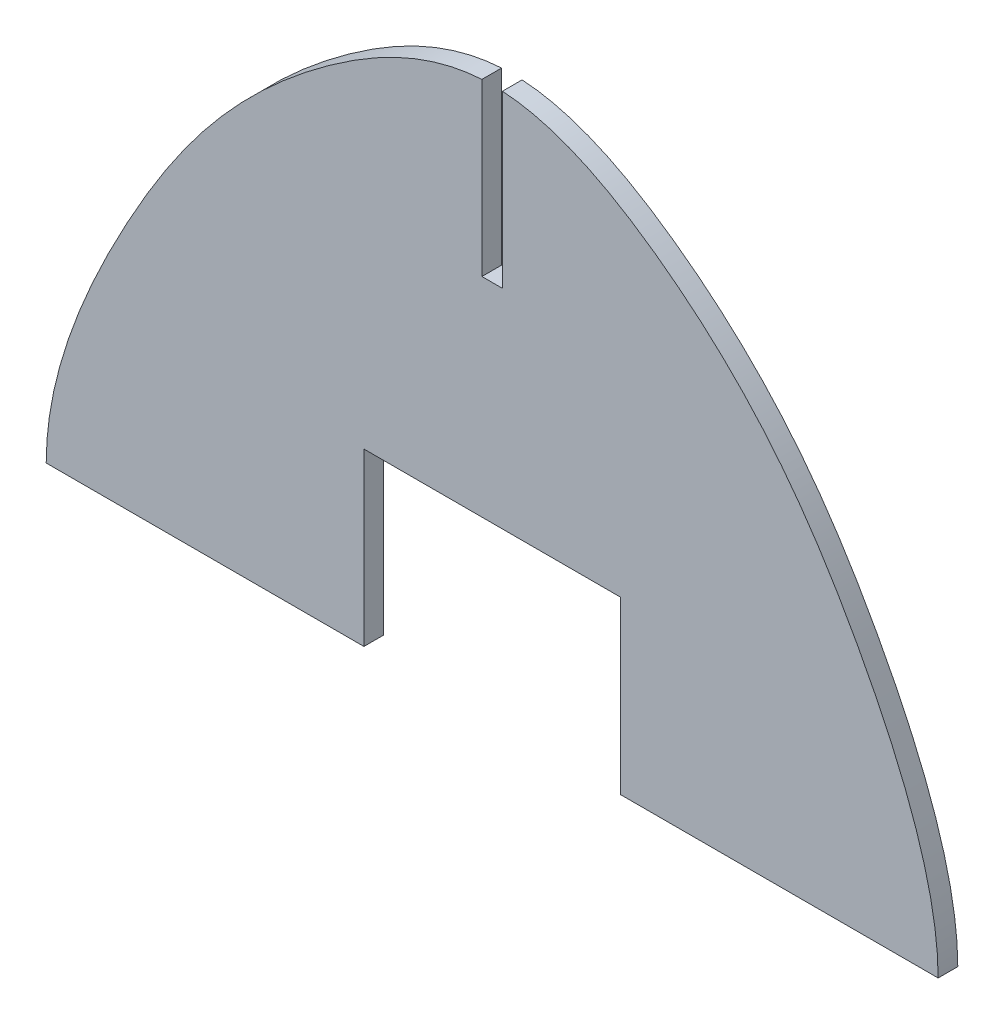
ISO-10303-21;
HEADER;
FILE_DESCRIPTION(('STEP AP214'),'2;1');
FILE_NAME('part.step','',(''),(''),'','','');
FILE_SCHEMA(('AUTOMOTIVE_DESIGN { 1 0 10303 214 1 1 1 1 }'));
ENDSEC;
DATA;
#1=APPLICATION_CONTEXT('core data for automotive mechanical design processes');
#2=APPLICATION_PROTOCOL_DEFINITION('international standard','automotive_design',2000,#1);
#3=PRODUCT_CONTEXT('',#1,'mechanical');
#4=PRODUCT('Part','Part','',(#3));
#5=PRODUCT_RELATED_PRODUCT_CATEGORY('part','',(#4));
#6=PRODUCT_DEFINITION_FORMATION('','',#4);
#7=PRODUCT_DEFINITION_CONTEXT('part definition',#1,'design');
#8=PRODUCT_DEFINITION('design','',#6,#7);
#9=PRODUCT_DEFINITION_SHAPE('','',#8);
#10=(LENGTH_UNIT() NAMED_UNIT(*) SI_UNIT(.MILLI.,.METRE.));
#11=(NAMED_UNIT(*) PLANE_ANGLE_UNIT() SI_UNIT($,.RADIAN.));
#12=(NAMED_UNIT(*) SI_UNIT($,.STERADIAN.) SOLID_ANGLE_UNIT());
#13=UNCERTAINTY_MEASURE_WITH_UNIT(LENGTH_MEASURE(1.E-05),#10,'distance_accuracy_value','');
#14=(GEOMETRIC_REPRESENTATION_CONTEXT(3) GLOBAL_UNCERTAINTY_ASSIGNED_CONTEXT((#13)) GLOBAL_UNIT_ASSIGNED_CONTEXT((#10,
#11,#12)) REPRESENTATION_CONTEXT('',''));
#15=CARTESIAN_POINT('',(0.,0.,0.));
#16=DIRECTION('',(0.,0.,1.));
#17=DIRECTION('',(1.,0.,0.));
#18=AXIS2_PLACEMENT_3D('',#15,#16,#17);
#19=CARTESIAN_POINT('',(132.489119035762,39.6875,5.842));
#20=CARTESIAN_POINT('',(132.489119035762,63.2909729194018,5.842));
#21=CARTESIAN_POINT('',(115.206186784233,104.366247760899,5.842));
#22=CARTESIAN_POINT('',(85.2181697360725,152.201932400349,5.842));
#23=CARTESIAN_POINT('',(50.0611592075586,185.921315786984,5.842));
#24=CARTESIAN_POINT('',(17.2354069814588,203.2,5.842));
#25=CARTESIAN_POINT('',(0.,203.2,5.842));
#26=B_SPLINE_CURVE_WITH_KNOTS('',3,(#19,#20,#21,#22,#23,#24,#25),.UNSPECIFIED.,.F.,.F.,(4,1,1,1,
4),(0.,0.346278085472437,0.536424087672413,0.768204279196818,1.),.UNSPECIFIED.);
#27=DIRECTION('',(0.,0.,-1.));
#28=VECTOR('',#27,1.);
#29=SURFACE_OF_LINEAR_EXTRUSION('',#26,#28);
#30=CARTESIAN_POINT('',(132.489119035762,39.6875,0.));
#31=CARTESIAN_POINT('',(132.489119035762,63.2909729194018,0.));
#32=CARTESIAN_POINT('',(115.206186784233,104.366247760899,0.));
#33=CARTESIAN_POINT('',(85.2181697360725,152.201932400349,0.));
#34=CARTESIAN_POINT('',(50.0611592075586,185.921315786984,0.));
#35=CARTESIAN_POINT('',(17.2354069814588,203.2,0.));
#36=CARTESIAN_POINT('',(0.,203.2,0.));
#37=B_SPLINE_CURVE_WITH_KNOTS('',3,(#30,#31,#32,#33,#34,#35,#36),.UNSPECIFIED.,.F.,.F.,(4,1,1,1,
4),(0.,0.346278085472437,0.536424087672413,0.768204279196818,1.),.UNSPECIFIED.);
#38=CARTESIAN_POINT('',(132.489119035762,39.6875,0.));
#39=VERTEX_POINT('',#38);
#40=CARTESIAN_POINT('',(3.048,203.110852389288,0.));
#41=VERTEX_POINT('',#40);
#42=EDGE_CURVE('E210',#39,#41,#37,.T.);
#43=ORIENTED_EDGE('',*,*,#42,.T.);
#44=DIRECTION('',(0.,0.,-1.));
#45=VECTOR('',#44,1.);
#46=CARTESIAN_POINT('',(3.048,203.11085238929,5.842));
#47=LINE('',#46,#45);
#48=CARTESIAN_POINT('',(3.048,203.110852389288,5.842));
#49=VERTEX_POINT('',#48);
#50=EDGE_CURVE('E223',#41,#49,#47,.F.);
#51=ORIENTED_EDGE('',*,*,#50,.T.);
#52=CARTESIAN_POINT('',(132.489119035762,39.6875,5.842));
#53=VERTEX_POINT('',#52);
#54=EDGE_CURVE('E202',#53,#49,#26,.T.);
#55=ORIENTED_EDGE('',*,*,#54,.F.);
#56=DIRECTION('',(0.,0.,-1.));
#57=VECTOR('',#56,1.);
#58=CARTESIAN_POINT('',(132.489119035762,39.6875,5.842));
#59=LINE('',#58,#57);
#60=EDGE_CURVE('E11',#53,#39,#59,.T.);
#61=ORIENTED_EDGE('',*,*,#60,.T.);
#62=EDGE_LOOP('',(#43,#51,#55,#61));
#63=FACE_BOUND('',#62,.T.);
#64=ADVANCED_FACE('F33',(#63),#29,.F.);
#65=CARTESIAN_POINT('',(132.489119035762,39.6875,5.842));
#66=DIRECTION('',(0.,1.,0.));
#67=DIRECTION('',(0.,0.,1.));
#68=AXIS2_PLACEMENT_3D('',#65,#66,#67);
#69=PLANE('',#68);
#70=DIRECTION('',(1.,0.,0.));
#71=VECTOR('',#70,1.);
#72=CARTESIAN_POINT('',(132.489119035762,39.6875,5.842));
#73=LINE('',#72,#71);
#74=CARTESIAN_POINT('',(38.1,39.6875,5.842));
#75=VERTEX_POINT('',#74);
#76=EDGE_CURVE('E41',#75,#53,#73,.T.);
#77=ORIENTED_EDGE('',*,*,#76,.F.);
#78=DIRECTION('',(0.,0.,1.));
#79=VECTOR('',#78,1.);
#80=CARTESIAN_POINT('',(38.1,39.6875,0.));
#81=LINE('',#80,#79);
#82=CARTESIAN_POINT('',(38.1,39.6875,0.));
#83=VERTEX_POINT('',#82);
#84=EDGE_CURVE('E198',#83,#75,#81,.T.);
#85=ORIENTED_EDGE('',*,*,#84,.F.);
#86=DIRECTION('',(1.,0.,0.));
#87=VECTOR('',#86,1.);
#88=CARTESIAN_POINT('',(132.489119035762,39.6875,0.));
#89=LINE('',#88,#87);
#90=EDGE_CURVE('E204',#83,#39,#89,.T.);
#91=ORIENTED_EDGE('',*,*,#90,.T.);
#92=ORIENTED_EDGE('',*,*,#60,.F.);
#93=EDGE_LOOP('',(#77,#85,#91,#92));
#94=FACE_BOUND('',#93,.T.);
#95=ADVANCED_FACE('F186',(#94),#69,.F.);
#96=CARTESIAN_POINT('',(90.4382620976423,142.31432271205,5.842));
#97=DIRECTION('',(0.,0.,1.));
#98=DIRECTION('',(1.,0.,0.));
#99=AXIS2_PLACEMENT_3D('',#96,#97,#98);
#100=PLANE('',#99);
#101=DIRECTION('',(0.,1.,0.));
#102=VECTOR('',#101,1.);
#103=CARTESIAN_POINT('',(3.048,203.2,5.842));
#104=LINE('',#103,#102);
#105=CARTESIAN_POINT('',(3.04800000000001,152.4,5.842));
#106=VERTEX_POINT('',#105);
#107=EDGE_CURVE('E118',#106,#49,#104,.T.);
#108=ORIENTED_EDGE('',*,*,#107,.F.);
#109=DIRECTION('',(1.,0.,0.));
#110=VECTOR('',#109,1.);
#111=CARTESIAN_POINT('',(0.,152.4,5.842));
#112=LINE('',#111,#110);
#113=CARTESIAN_POINT('',(-3.04800000000001,152.4,5.842));
#114=VERTEX_POINT('',#113);
#115=EDGE_CURVE('E110',#114,#106,#112,.T.);
#116=ORIENTED_EDGE('',*,*,#115,.F.);
#117=DIRECTION('',(0.,1.,0.));
#118=VECTOR('',#117,1.);
#119=CARTESIAN_POINT('',(-3.048,203.2,5.842));
#120=LINE('',#119,#118);
#121=CARTESIAN_POINT('',(-3.048,203.110852389288,5.842));
#122=VERTEX_POINT('',#121);
#123=EDGE_CURVE('E115',#114,#122,#120,.T.);
#124=ORIENTED_EDGE('',*,*,#123,.T.);
#125=CARTESIAN_POINT('',(-132.489119035762,39.6875,5.842));
#126=CARTESIAN_POINT('',(-132.489119035762,63.2909729194018,5.842));
#127=CARTESIAN_POINT('',(-115.206186784233,104.366247760899,5.842));
#128=CARTESIAN_POINT('',(-85.2181697360725,152.201932400349,5.842));
#129=CARTESIAN_POINT('',(-50.0611592075586,185.921315786984,5.842));
#130=CARTESIAN_POINT('',(-17.2354069814588,203.2,5.842));
#131=CARTESIAN_POINT('',(0.,203.2,5.842));
#132=B_SPLINE_CURVE_WITH_KNOTS('',3,(#125,#126,#127,#128,#129,#130,#131),.UNSPECIFIED.,.F.,.F.,
(4,1,1,1,4),(0.,0.346278085472437,0.536424087672413,0.768204279196818,1.),.UNSPECIFIED.);
#133=CARTESIAN_POINT('',(-132.489119035762,39.6875,5.842));
#134=VERTEX_POINT('',#133);
#135=EDGE_CURVE('E152',#134,#122,#132,.T.);
#136=ORIENTED_EDGE('',*,*,#135,.F.);
#137=DIRECTION('',(-1.,0.,0.));
#138=VECTOR('',#137,1.);
#139=CARTESIAN_POINT('',(-132.489119035762,39.6875,5.842));
#140=LINE('',#139,#138);
#141=CARTESIAN_POINT('',(-38.1,39.6875,5.842));
#142=VERTEX_POINT('',#141);
#143=EDGE_CURVE('E157',#142,#134,#140,.T.);
#144=ORIENTED_EDGE('',*,*,#143,.F.);
#145=DIRECTION('',(0.,1.,0.));
#146=VECTOR('',#145,1.);
#147=CARTESIAN_POINT('',(-38.1,39.6875,5.842));
#148=LINE('',#147,#146);
#149=CARTESIAN_POINT('',(-38.1,90.4875,5.842));
#150=VERTEX_POINT('',#149);
#151=EDGE_CURVE('E139',#142,#150,#148,.T.);
#152=ORIENTED_EDGE('',*,*,#151,.T.);
#153=DIRECTION('',(-1.,0.,0.));
#154=VECTOR('',#153,1.);
#155=CARTESIAN_POINT('',(0.,90.4875,5.842));
#156=LINE('',#155,#154);
#157=CARTESIAN_POINT('',(38.1,90.4875,5.842));
#158=VERTEX_POINT('',#157);
#159=EDGE_CURVE('E233',#158,#150,#156,.T.);
#160=ORIENTED_EDGE('',*,*,#159,.F.);
#161=DIRECTION('',(0.,1.,0.));
#162=VECTOR('',#161,1.);
#163=CARTESIAN_POINT('',(38.1,39.6875,5.842));
#164=LINE('',#163,#162);
#165=EDGE_CURVE('E230',#75,#158,#164,.T.);
#166=ORIENTED_EDGE('',*,*,#165,.F.);
#167=ORIENTED_EDGE('',*,*,#76,.T.);
#168=ORIENTED_EDGE('',*,*,#54,.T.);
#169=EDGE_LOOP('',(#108,#116,#124,#136,#144,#152,#160,#166,#167,#168));
#170=FACE_BOUND('',#169,.T.);
#171=ADVANCED_FACE('F112',(#170),#100,.T.);
#172=CARTESIAN_POINT('',(90.4382620976423,142.31432271205,0.));
#173=DIRECTION('',(0.,0.,1.));
#174=DIRECTION('',(1.,0.,0.));
#175=AXIS2_PLACEMENT_3D('',#172,#173,#174);
#176=PLANE('',#175);
#177=DIRECTION('',(1.,0.,0.));
#178=VECTOR('',#177,1.);
#179=CARTESIAN_POINT('',(0.,152.4,0.));
#180=LINE('',#179,#178);
#181=CARTESIAN_POINT('',(-3.04800000000001,152.4,0.));
#182=VERTEX_POINT('',#181);
#183=CARTESIAN_POINT('',(3.04800000000001,152.4,0.));
#184=VERTEX_POINT('',#183);
#185=EDGE_CURVE('E126',#182,#184,#180,.T.);
#186=ORIENTED_EDGE('',*,*,#185,.T.);
#187=DIRECTION('',(0.,1.,0.));
#188=VECTOR('',#187,1.);
#189=CARTESIAN_POINT('',(3.048,203.2,0.));
#190=LINE('',#189,#188);
#191=EDGE_CURVE('E48',#184,#41,#190,.T.);
#192=ORIENTED_EDGE('',*,*,#191,.T.);
#193=ORIENTED_EDGE('',*,*,#42,.F.);
#194=ORIENTED_EDGE('',*,*,#90,.F.);
#195=DIRECTION('',(0.,1.,0.));
#196=VECTOR('',#195,1.);
#197=CARTESIAN_POINT('',(38.1,39.6875,0.));
#198=LINE('',#197,#196);
#199=CARTESIAN_POINT('',(38.1,90.4875,0.));
#200=VERTEX_POINT('',#199);
#201=EDGE_CURVE('E231',#83,#200,#198,.T.);
#202=ORIENTED_EDGE('',*,*,#201,.T.);
#203=DIRECTION('',(-1.,0.,0.));
#204=VECTOR('',#203,1.);
#205=CARTESIAN_POINT('',(0.,90.4875,0.));
#206=LINE('',#205,#204);
#207=CARTESIAN_POINT('',(-38.1,90.4875,0.));
#208=VERTEX_POINT('',#207);
#209=EDGE_CURVE('E56',#200,#208,#206,.T.);
#210=ORIENTED_EDGE('',*,*,#209,.T.);
#211=DIRECTION('',(0.,1.,0.));
#212=VECTOR('',#211,1.);
#213=CARTESIAN_POINT('',(-38.1,39.6875,0.));
#214=LINE('',#213,#212);
#215=CARTESIAN_POINT('',(-38.1,39.6875,0.));
#216=VERTEX_POINT('',#215);
#217=EDGE_CURVE('E140',#216,#208,#214,.T.);
#218=ORIENTED_EDGE('',*,*,#217,.F.);
#219=DIRECTION('',(-1.,0.,0.));
#220=VECTOR('',#219,1.);
#221=CARTESIAN_POINT('',(-132.489119035762,39.6875,0.));
#222=LINE('',#221,#220);
#223=CARTESIAN_POINT('',(-132.489119035762,39.6875,0.));
#224=VERTEX_POINT('',#223);
#225=EDGE_CURVE('E158',#216,#224,#222,.T.);
#226=ORIENTED_EDGE('',*,*,#225,.T.);
#227=CARTESIAN_POINT('',(-132.489119035762,39.6875,0.));
#228=CARTESIAN_POINT('',(-132.489119035762,63.2909729194018,0.));
#229=CARTESIAN_POINT('',(-115.206186784233,104.366247760899,0.));
#230=CARTESIAN_POINT('',(-85.2181697360725,152.201932400349,0.));
#231=CARTESIAN_POINT('',(-50.0611592075586,185.921315786984,0.));
#232=CARTESIAN_POINT('',(-17.2354069814588,203.2,0.));
#233=CARTESIAN_POINT('',(0.,203.2,0.));
#234=B_SPLINE_CURVE_WITH_KNOTS('',3,(#227,#228,#229,#230,#231,#232,#233),.UNSPECIFIED.,.F.,.F.,
(4,1,1,1,4),(0.,0.346278085472437,0.536424087672413,0.768204279196818,1.),.UNSPECIFIED.);
#235=CARTESIAN_POINT('',(-3.048,203.110852389288,0.));
#236=VERTEX_POINT('',#235);
#237=EDGE_CURVE('E149',#224,#236,#234,.T.);
#238=ORIENTED_EDGE('',*,*,#237,.T.);
#239=DIRECTION('',(0.,1.,0.));
#240=VECTOR('',#239,1.);
#241=CARTESIAN_POINT('',(-3.048,203.2,0.));
#242=LINE('',#241,#240);
#243=EDGE_CURVE('E130',#182,#236,#242,.T.);
#244=ORIENTED_EDGE('',*,*,#243,.F.);
#245=EDGE_LOOP('',(#186,#192,#193,#194,#202,#210,#218,#226,#238,#244));
#246=FACE_BOUND('',#245,.T.);
#247=ADVANCED_FACE('F180',(#246),#176,.F.);
#248=CARTESIAN_POINT('',(0.,90.4875,0.));
#249=DIRECTION('',(0.,1.,0.));
#250=DIRECTION('',(0.,0.,1.));
#251=AXIS2_PLACEMENT_3D('',#248,#249,#250);
#252=PLANE('',#251);
#253=ORIENTED_EDGE('',*,*,#159,.T.);
#254=DIRECTION('',(0.,0.,1.));
#255=VECTOR('',#254,1.);
#256=CARTESIAN_POINT('',(-38.1,90.4875,0.));
#257=LINE('',#256,#255);
#258=EDGE_CURVE('E146',#208,#150,#257,.T.);
#259=ORIENTED_EDGE('',*,*,#258,.F.);
#260=ORIENTED_EDGE('',*,*,#209,.F.);
#261=DIRECTION('',(0.,0.,1.));
#262=VECTOR('',#261,1.);
#263=CARTESIAN_POINT('',(38.1,90.4875,0.));
#264=LINE('',#263,#262);
#265=EDGE_CURVE('E214',#200,#158,#264,.T.);
#266=ORIENTED_EDGE('',*,*,#265,.T.);
#267=EDGE_LOOP('',(#253,#259,#260,#266));
#268=FACE_BOUND('',#267,.T.);
#269=ADVANCED_FACE('F177',(#268),#252,.F.);
#270=CARTESIAN_POINT('',(38.1,39.6875,0.));
#271=DIRECTION('',(1.,0.,0.));
#272=DIRECTION('',(0.,0.,-1.));
#273=AXIS2_PLACEMENT_3D('',#270,#271,#272);
#274=PLANE('',#273);
#275=ORIENTED_EDGE('',*,*,#165,.T.);
#276=ORIENTED_EDGE('',*,*,#265,.F.);
#277=ORIENTED_EDGE('',*,*,#201,.F.);
#278=ORIENTED_EDGE('',*,*,#84,.T.);
#279=EDGE_LOOP('',(#275,#276,#277,#278));
#280=FACE_BOUND('',#279,.T.);
#281=ADVANCED_FACE('F174',(#280),#274,.F.);
#282=CARTESIAN_POINT('',(3.048,203.2,0.));
#283=DIRECTION('',(1.,0.,0.));
#284=DIRECTION('',(0.,1.,0.));
#285=AXIS2_PLACEMENT_3D('',#282,#283,#284);
#286=PLANE('',#285);
#287=ORIENTED_EDGE('',*,*,#191,.F.);
#288=DIRECTION('',(0.,0.,1.));
#289=VECTOR('',#288,1.);
#290=CARTESIAN_POINT('',(3.04800000000001,152.4,0.));
#291=LINE('',#290,#289);
#292=EDGE_CURVE('E221',#184,#106,#291,.T.);
#293=ORIENTED_EDGE('',*,*,#292,.T.);
#294=ORIENTED_EDGE('',*,*,#107,.T.);
#295=ORIENTED_EDGE('',*,*,#50,.F.);
#296=EDGE_LOOP('',(#287,#293,#294,#295));
#297=FACE_BOUND('',#296,.T.);
#298=ADVANCED_FACE('F171',(#297),#286,.F.);
#299=CARTESIAN_POINT('',(0.,152.4,0.));
#300=DIRECTION('',(0.,-1.,0.));
#301=DIRECTION('',(0.,0.,-1.));
#302=AXIS2_PLACEMENT_3D('',#299,#300,#301);
#303=PLANE('',#302);
#304=ORIENTED_EDGE('',*,*,#115,.T.);
#305=ORIENTED_EDGE('',*,*,#292,.F.);
#306=ORIENTED_EDGE('',*,*,#185,.F.);
#307=DIRECTION('',(0.,0.,1.));
#308=VECTOR('',#307,1.);
#309=CARTESIAN_POINT('',(-3.04800000000001,152.4,0.));
#310=LINE('',#309,#308);
#311=EDGE_CURVE('E123',#182,#114,#310,.T.);
#312=ORIENTED_EDGE('',*,*,#311,.T.);
#313=EDGE_LOOP('',(#304,#305,#306,#312));
#314=FACE_BOUND('',#313,.T.);
#315=ADVANCED_FACE('F124',(#314),#303,.F.);
#316=DIRECTION('',(0.,0.,-1.));
#317=VECTOR('',#316,1.);
#318=SURFACE_OF_LINEAR_EXTRUSION('',#132,#317);
#319=ORIENTED_EDGE('',*,*,#237,.F.);
#320=DIRECTION('',(0.,0.,-1.));
#321=VECTOR('',#320,1.);
#322=CARTESIAN_POINT('',(-132.489119035762,39.6875,5.842));
#323=LINE('',#322,#321);
#324=EDGE_CURVE('E120',#134,#224,#323,.T.);
#325=ORIENTED_EDGE('',*,*,#324,.F.);
#326=ORIENTED_EDGE('',*,*,#135,.T.);
#327=DIRECTION('',(0.,0.,-1.));
#328=VECTOR('',#327,1.);
#329=CARTESIAN_POINT('',(-3.048,203.11085238929,5.842));
#330=LINE('',#329,#328);
#331=EDGE_CURVE('E129',#236,#122,#330,.F.);
#332=ORIENTED_EDGE('',*,*,#331,.F.);
#333=EDGE_LOOP('',(#319,#325,#326,#332));
#334=FACE_BOUND('',#333,.T.);
#335=ADVANCED_FACE('F164',(#334),#318,.T.);
#336=CARTESIAN_POINT('',(-132.489119035762,39.6875,5.842));
#337=DIRECTION('',(0.,1.,0.));
#338=DIRECTION('',(0.,0.,1.));
#339=AXIS2_PLACEMENT_3D('',#336,#337,#338);
#340=PLANE('',#339);
#341=ORIENTED_EDGE('',*,*,#143,.T.);
#342=ORIENTED_EDGE('',*,*,#324,.T.);
#343=ORIENTED_EDGE('',*,*,#225,.F.);
#344=DIRECTION('',(0.,0.,1.));
#345=VECTOR('',#344,1.);
#346=CARTESIAN_POINT('',(-38.1,39.6875,0.));
#347=LINE('',#346,#345);
#348=EDGE_CURVE('E143',#216,#142,#347,.T.);
#349=ORIENTED_EDGE('',*,*,#348,.T.);
#350=EDGE_LOOP('',(#341,#342,#343,#349));
#351=FACE_BOUND('',#350,.T.);
#352=ADVANCED_FACE('F168',(#351),#340,.F.);
#353=CARTESIAN_POINT('',(-38.1,39.6875,0.));
#354=DIRECTION('',(-1.,0.,0.));
#355=DIRECTION('',(0.,0.,-1.));
#356=AXIS2_PLACEMENT_3D('',#353,#354,#355);
#357=PLANE('',#356);
#358=ORIENTED_EDGE('',*,*,#151,.F.);
#359=ORIENTED_EDGE('',*,*,#348,.F.);
#360=ORIENTED_EDGE('',*,*,#217,.T.);
#361=ORIENTED_EDGE('',*,*,#258,.T.);
#362=EDGE_LOOP('',(#358,#359,#360,#361));
#363=FACE_BOUND('',#362,.T.);
#364=ADVANCED_FACE('F241',(#363),#357,.F.);
#365=CARTESIAN_POINT('',(-3.048,203.2,0.));
#366=DIRECTION('',(-1.,0.,0.));
#367=DIRECTION('',(0.,1.,0.));
#368=AXIS2_PLACEMENT_3D('',#365,#366,#367);
#369=PLANE('',#368);
#370=ORIENTED_EDGE('',*,*,#243,.T.);
#371=ORIENTED_EDGE('',*,*,#331,.T.);
#372=ORIENTED_EDGE('',*,*,#123,.F.);
#373=ORIENTED_EDGE('',*,*,#311,.F.);
#374=EDGE_LOOP('',(#370,#371,#372,#373));
#375=FACE_BOUND('',#374,.T.);
#376=ADVANCED_FACE('F132',(#375),#369,.F.);
#377=CLOSED_SHELL('',(#64,#95,#171,#247,#269,#281,#298,#315,#335,#352,#364,#376));
#378=MANIFOLD_SOLID_BREP('B2',#377);
#379=ADVANCED_BREP_SHAPE_REPRESENTATION('',(#18,#378),#14);
#380=SHAPE_DEFINITION_REPRESENTATION(#9,#379);
ENDSEC;
END-ISO-10303-21;
